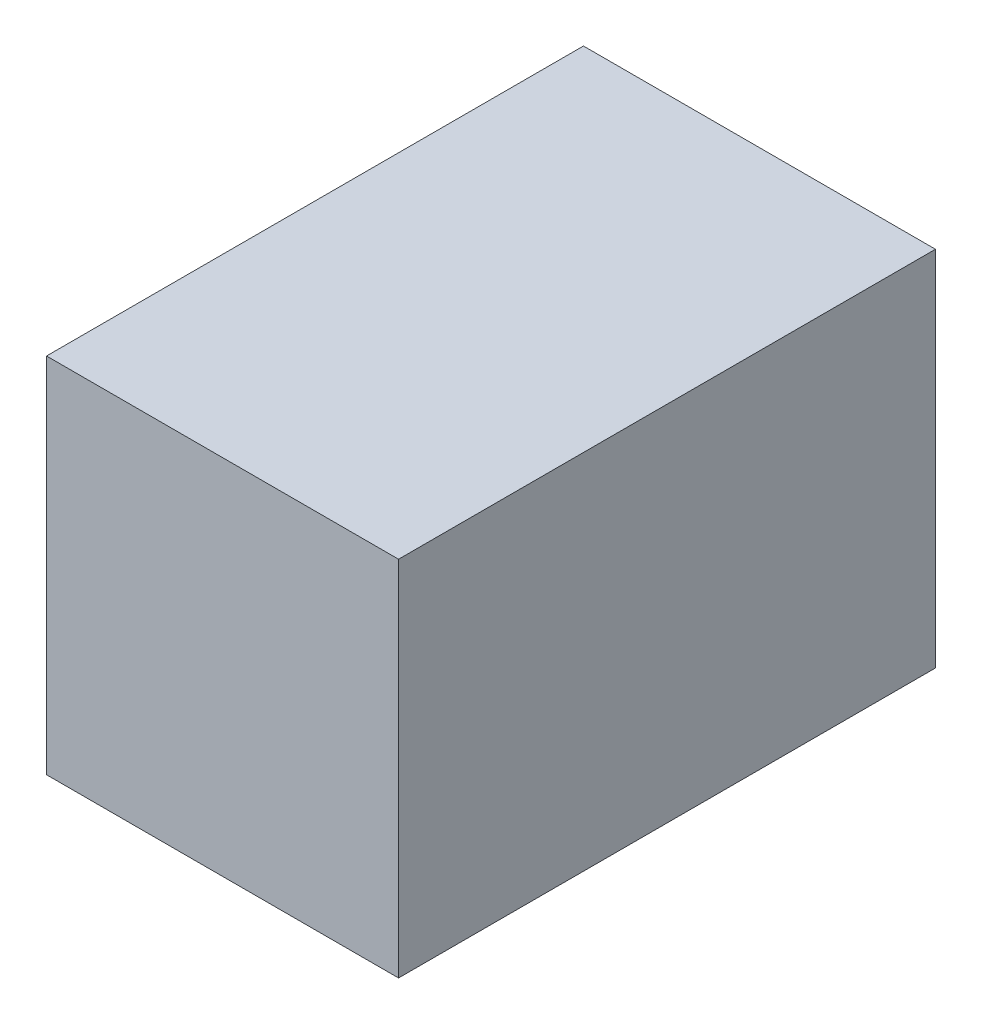
ISO-10303-21;
HEADER;
FILE_DESCRIPTION(('STEP AP214'),'2;1');
FILE_NAME('part.step','',(''),(''),'','','');
FILE_SCHEMA(('AUTOMOTIVE_DESIGN { 1 0 10303 214 1 1 1 1 }'));
ENDSEC;
DATA;
#1=APPLICATION_CONTEXT('core data for automotive mechanical design processes');
#2=APPLICATION_PROTOCOL_DEFINITION('international standard','automotive_design',2000,#1);
#3=PRODUCT_CONTEXT('',#1,'mechanical');
#4=PRODUCT('Part','Part','',(#3));
#5=PRODUCT_RELATED_PRODUCT_CATEGORY('part','',(#4));
#6=PRODUCT_DEFINITION_FORMATION('','',#4);
#7=PRODUCT_DEFINITION_CONTEXT('part definition',#1,'design');
#8=PRODUCT_DEFINITION('design','',#6,#7);
#9=PRODUCT_DEFINITION_SHAPE('','',#8);
#10=(LENGTH_UNIT() NAMED_UNIT(*) SI_UNIT(.MILLI.,.METRE.));
#11=(NAMED_UNIT(*) PLANE_ANGLE_UNIT() SI_UNIT($,.RADIAN.));
#12=(NAMED_UNIT(*) SI_UNIT($,.STERADIAN.) SOLID_ANGLE_UNIT());
#13=UNCERTAINTY_MEASURE_WITH_UNIT(LENGTH_MEASURE(1.E-05),#10,'distance_accuracy_value','');
#14=(GEOMETRIC_REPRESENTATION_CONTEXT(3) GLOBAL_UNCERTAINTY_ASSIGNED_CONTEXT((#13)) GLOBAL_UNIT_ASSIGNED_CONTEXT((#10,
#11,#12)) REPRESENTATION_CONTEXT('',''));
#15=CARTESIAN_POINT('',(0.,0.,0.));
#16=DIRECTION('',(0.,0.,1.));
#17=DIRECTION('',(1.,0.,0.));
#18=AXIS2_PLACEMENT_3D('',#15,#16,#17);
#19=CARTESIAN_POINT('',(0.,0.,151.));
#20=DIRECTION('',(-1.,0.,0.));
#21=DIRECTION('',(0.,-1.,0.));
#22=AXIS2_PLACEMENT_3D('',#19,#20,#21);
#23=PLANE('',#22);
#24=DIRECTION('',(0.,1.,0.));
#25=VECTOR('',#24,1.);
#26=CARTESIAN_POINT('',(0.,0.,0.));
#27=LINE('',#26,#25);
#28=CARTESIAN_POINT('',(0.,-102.,0.));
#29=VERTEX_POINT('',#28);
#30=CARTESIAN_POINT('',(0.,0.,0.));
#31=VERTEX_POINT('',#30);
#32=EDGE_CURVE('E96',#29,#31,#27,.T.);
#33=ORIENTED_EDGE('',*,*,#32,.T.);
#34=DIRECTION('',(0.,0.,-1.));
#35=VECTOR('',#34,1.);
#36=CARTESIAN_POINT('',(0.,0.,151.));
#37=LINE('',#36,#35);
#38=CARTESIAN_POINT('',(0.,0.,151.));
#39=VERTEX_POINT('',#38);
#40=EDGE_CURVE('E11',#39,#31,#37,.T.);
#41=ORIENTED_EDGE('',*,*,#40,.F.);
#42=DIRECTION('',(0.,1.,0.));
#43=VECTOR('',#42,1.);
#44=CARTESIAN_POINT('',(0.,0.,151.));
#45=LINE('',#44,#43);
#46=CARTESIAN_POINT('',(0.,-102.,151.));
#47=VERTEX_POINT('',#46);
#48=EDGE_CURVE('E84',#47,#39,#45,.T.);
#49=ORIENTED_EDGE('',*,*,#48,.F.);
#50=DIRECTION('',(0.,0.,-1.));
#51=VECTOR('',#50,1.);
#52=CARTESIAN_POINT('',(0.,-102.,151.));
#53=LINE('',#52,#51);
#54=EDGE_CURVE('E92',#47,#29,#53,.T.);
#55=ORIENTED_EDGE('',*,*,#54,.T.);
#56=EDGE_LOOP('',(#33,#41,#49,#55));
#57=FACE_BOUND('',#56,.T.);
#58=ADVANCED_FACE('F33',(#57),#23,.F.);
#59=CARTESIAN_POINT('',(0.,0.,151.));
#60=DIRECTION('',(0.,-1.,0.));
#61=DIRECTION('',(0.,0.,-1.));
#62=AXIS2_PLACEMENT_3D('',#59,#60,#61);
#63=PLANE('',#62);
#64=DIRECTION('',(-1.,0.,0.));
#65=VECTOR('',#64,1.);
#66=CARTESIAN_POINT('',(0.,0.,0.));
#67=LINE('',#66,#65);
#68=CARTESIAN_POINT('',(-99.,0.,0.));
#69=VERTEX_POINT('',#68);
#70=EDGE_CURVE('E88',#31,#69,#67,.T.);
#71=ORIENTED_EDGE('',*,*,#70,.T.);
#72=DIRECTION('',(0.,0.,-1.));
#73=VECTOR('',#72,1.);
#74=CARTESIAN_POINT('',(-99.,0.,151.));
#75=LINE('',#74,#73);
#76=CARTESIAN_POINT('',(-99.,0.,151.));
#77=VERTEX_POINT('',#76);
#78=EDGE_CURVE('E41',#77,#69,#75,.T.);
#79=ORIENTED_EDGE('',*,*,#78,.F.);
#80=DIRECTION('',(-1.,0.,0.));
#81=VECTOR('',#80,1.);
#82=CARTESIAN_POINT('',(0.,0.,151.));
#83=LINE('',#82,#81);
#84=EDGE_CURVE('E79',#39,#77,#83,.T.);
#85=ORIENTED_EDGE('',*,*,#84,.F.);
#86=ORIENTED_EDGE('',*,*,#40,.T.);
#87=EDGE_LOOP('',(#71,#79,#85,#86));
#88=FACE_BOUND('',#87,.T.);
#89=ADVANCED_FACE('F87',(#88),#63,.F.);
#90=CARTESIAN_POINT('',(-99.,0.,151.));
#91=DIRECTION('',(1.,0.,0.));
#92=DIRECTION('',(0.,1.,0.));
#93=AXIS2_PLACEMENT_3D('',#90,#91,#92);
#94=PLANE('',#93);
#95=DIRECTION('',(0.,-1.,0.));
#96=VECTOR('',#95,1.);
#97=CARTESIAN_POINT('',(-99.,0.,0.));
#98=LINE('',#97,#96);
#99=CARTESIAN_POINT('',(-99.,-102.,0.));
#100=VERTEX_POINT('',#99);
#101=EDGE_CURVE('E66',#69,#100,#98,.T.);
#102=ORIENTED_EDGE('',*,*,#101,.T.);
#103=DIRECTION('',(0.,0.,-1.));
#104=VECTOR('',#103,1.);
#105=CARTESIAN_POINT('',(-99.,-102.,151.));
#106=LINE('',#105,#104);
#107=CARTESIAN_POINT('',(-99.,-102.,151.));
#108=VERTEX_POINT('',#107);
#109=EDGE_CURVE('E89',#108,#100,#106,.T.);
#110=ORIENTED_EDGE('',*,*,#109,.F.);
#111=DIRECTION('',(0.,-1.,0.));
#112=VECTOR('',#111,1.);
#113=CARTESIAN_POINT('',(-99.,0.,151.));
#114=LINE('',#113,#112);
#115=EDGE_CURVE('E82',#77,#108,#114,.T.);
#116=ORIENTED_EDGE('',*,*,#115,.F.);
#117=ORIENTED_EDGE('',*,*,#78,.T.);
#118=EDGE_LOOP('',(#102,#110,#116,#117));
#119=FACE_BOUND('',#118,.T.);
#120=ADVANCED_FACE('F90',(#119),#94,.F.);
#121=CARTESIAN_POINT('',(0.,-102.,151.));
#122=DIRECTION('',(0.,1.,0.));
#123=DIRECTION('',(-1.,0.,0.));
#124=AXIS2_PLACEMENT_3D('',#121,#122,#123);
#125=PLANE('',#124);
#126=DIRECTION('',(1.,0.,0.));
#127=VECTOR('',#126,1.);
#128=CARTESIAN_POINT('',(0.,-102.,0.));
#129=LINE('',#128,#127);
#130=EDGE_CURVE('E72',#100,#29,#129,.T.);
#131=ORIENTED_EDGE('',*,*,#130,.T.);
#132=ORIENTED_EDGE('',*,*,#54,.F.);
#133=DIRECTION('',(1.,0.,0.));
#134=VECTOR('',#133,1.);
#135=CARTESIAN_POINT('',(0.,-102.,151.));
#136=LINE('',#135,#134);
#137=EDGE_CURVE('E49',#108,#47,#136,.T.);
#138=ORIENTED_EDGE('',*,*,#137,.F.);
#139=ORIENTED_EDGE('',*,*,#109,.T.);
#140=EDGE_LOOP('',(#131,#132,#138,#139));
#141=FACE_BOUND('',#140,.T.);
#142=ADVANCED_FACE('F103',(#141),#125,.F.);
#143=CARTESIAN_POINT('',(0.,0.,151.));
#144=DIRECTION('',(0.,0.,-1.));
#145=DIRECTION('',(-1.,0.,0.));
#146=AXIS2_PLACEMENT_3D('',#143,#144,#145);
#147=PLANE('',#146);
#148=ORIENTED_EDGE('',*,*,#48,.T.);
#149=ORIENTED_EDGE('',*,*,#84,.T.);
#150=ORIENTED_EDGE('',*,*,#115,.T.);
#151=ORIENTED_EDGE('',*,*,#137,.T.);
#152=EDGE_LOOP('',(#148,#149,#150,#151));
#153=FACE_BOUND('',#152,.T.);
#154=ADVANCED_FACE('F80',(#153),#147,.F.);
#155=CARTESIAN_POINT('',(0.,0.,0.));
#156=DIRECTION('',(0.,0.,-1.));
#157=DIRECTION('',(-1.,0.,0.));
#158=AXIS2_PLACEMENT_3D('',#155,#156,#157);
#159=PLANE('',#158);
#160=ORIENTED_EDGE('',*,*,#32,.F.);
#161=ORIENTED_EDGE('',*,*,#130,.F.);
#162=ORIENTED_EDGE('',*,*,#101,.F.);
#163=ORIENTED_EDGE('',*,*,#70,.F.);
#164=EDGE_LOOP('',(#160,#161,#162,#163));
#165=FACE_BOUND('',#164,.T.);
#166=ADVANCED_FACE('F106',(#165),#159,.T.);
#167=CLOSED_SHELL('',(#58,#89,#120,#142,#154,#166));
#168=MANIFOLD_SOLID_BREP('B2',#167);
#169=ADVANCED_BREP_SHAPE_REPRESENTATION('',(#18,#168),#14);
#170=SHAPE_DEFINITION_REPRESENTATION(#9,#169);
ENDSEC;
END-ISO-10303-21;
